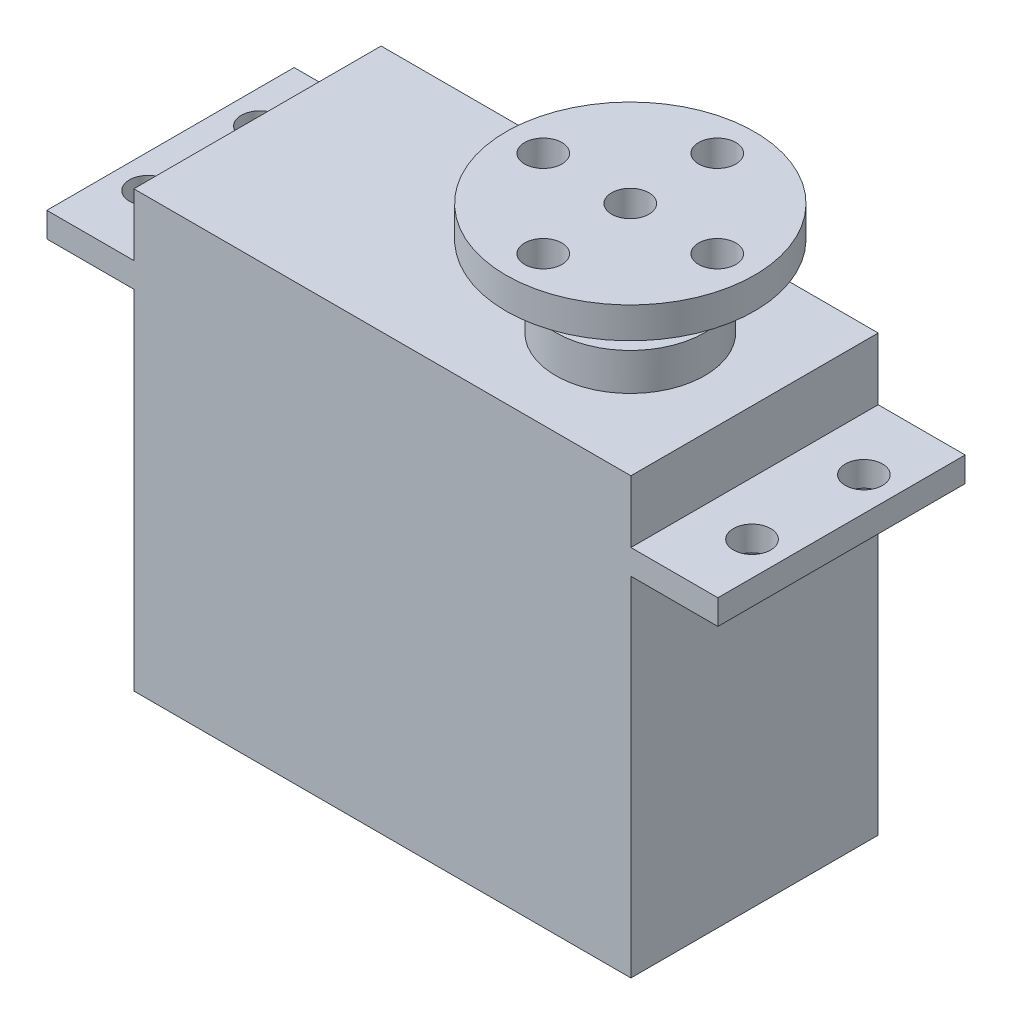
ISO-10303-21;
HEADER;
FILE_DESCRIPTION(('STEP AP214'),'2;1');
FILE_NAME('part.step','',(''),(''),'','','');
FILE_SCHEMA(('AUTOMOTIVE_DESIGN { 1 0 10303 214 1 1 1 1 }'));
ENDSEC;
DATA;
#1=APPLICATION_CONTEXT('core data for automotive mechanical design processes');
#2=APPLICATION_PROTOCOL_DEFINITION('international standard','automotive_design',2000,#1);
#3=PRODUCT_CONTEXT('',#1,'mechanical');
#4=PRODUCT('Part','Part','',(#3));
#5=PRODUCT_RELATED_PRODUCT_CATEGORY('part','',(#4));
#6=PRODUCT_DEFINITION_FORMATION('','',#4);
#7=PRODUCT_DEFINITION_CONTEXT('part definition',#1,'design');
#8=PRODUCT_DEFINITION('design','',#6,#7);
#9=PRODUCT_DEFINITION_SHAPE('','',#8);
#10=(LENGTH_UNIT() NAMED_UNIT(*) SI_UNIT(.MILLI.,.METRE.));
#11=(NAMED_UNIT(*) PLANE_ANGLE_UNIT() SI_UNIT($,.RADIAN.));
#12=(NAMED_UNIT(*) SI_UNIT($,.STERADIAN.) SOLID_ANGLE_UNIT());
#13=UNCERTAINTY_MEASURE_WITH_UNIT(LENGTH_MEASURE(1.E-05),#10,'distance_accuracy_value','');
#14=(GEOMETRIC_REPRESENTATION_CONTEXT(3) GLOBAL_UNCERTAINTY_ASSIGNED_CONTEXT((#13)) GLOBAL_UNIT_ASSIGNED_CONTEXT((#10,
#11,#12)) REPRESENTATION_CONTEXT('',''));
#15=CARTESIAN_POINT('',(0.,0.,0.));
#16=DIRECTION('',(0.,0.,1.));
#17=DIRECTION('',(1.,0.,0.));
#18=AXIS2_PLACEMENT_3D('',#15,#16,#17);
#19=CARTESIAN_POINT('',(9.99999999999999,41.5,0.));
#20=DIRECTION('',(0.,-1.,0.));
#21=DIRECTION('',(0.,0.,-1.));
#22=AXIS2_PLACEMENT_3D('',#19,#20,#21);
#23=CYLINDRICAL_SURFACE('',#22,3.);
#24=CARTESIAN_POINT('',(9.99999999999999,38.,0.));
#25=DIRECTION('',(0.,1.,0.));
#26=DIRECTION('',(0.,0.,1.));
#27=AXIS2_PLACEMENT_3D('',#24,#25,#26);
#28=CIRCLE('',#27,3.);
#29=CARTESIAN_POINT('',(9.99999999999999,38.,-3.));
#30=VERTEX_POINT('',#29);
#31=EDGE_CURVE('E253',#30,#30,#28,.T.);
#32=CARTESIAN_POINT('',(9.99999999999999,39.5,0.));
#33=DIRECTION('',(0.,1.,0.));
#34=DIRECTION('',(0.,0.,1.));
#35=AXIS2_PLACEMENT_3D('',#32,#33,#34);
#36=CIRCLE('',#35,3.);
#37=CARTESIAN_POINT('',(9.99999999999999,39.5,-3.));
#38=VERTEX_POINT('',#37);
#39=EDGE_CURVE('E11',#38,#38,#36,.T.);
#40=CARTESIAN_POINT('',(9.99999999999999,38.,-3.));
#41=CARTESIAN_POINT('',(9.99999999999999,38.015625,-3.));
#42=CARTESIAN_POINT('',(9.99999999999999,38.03125,-3.));
#43=CARTESIAN_POINT('',(9.99999999999999,38.0625,-3.));
#44=CARTESIAN_POINT('',(9.99999999999999,38.078125,-3.));
#45=CARTESIAN_POINT('',(9.99999999999999,38.109375,-3.));
#46=CARTESIAN_POINT('',(9.99999999999999,38.125,-3.));
#47=CARTESIAN_POINT('',(9.99999999999999,38.15625,-3.));
#48=CARTESIAN_POINT('',(9.99999999999999,38.171875,-3.));
#49=CARTESIAN_POINT('',(9.99999999999999,38.203125,-3.));
#50=CARTESIAN_POINT('',(9.99999999999999,38.21875,-3.));
#51=CARTESIAN_POINT('',(9.99999999999999,38.25,-3.));
#52=CARTESIAN_POINT('',(9.99999999999999,38.265625,-3.));
#53=CARTESIAN_POINT('',(9.99999999999999,38.296875,-3.));
#54=CARTESIAN_POINT('',(9.99999999999999,38.3125,-3.));
#55=CARTESIAN_POINT('',(9.99999999999999,38.34375,-3.));
#56=CARTESIAN_POINT('',(9.99999999999999,38.359375,-3.));
#57=CARTESIAN_POINT('',(9.99999999999999,38.390625,-3.));
#58=CARTESIAN_POINT('',(9.99999999999999,38.40625,-3.));
#59=CARTESIAN_POINT('',(9.99999999999999,38.4375,-3.));
#60=CARTESIAN_POINT('',(9.99999999999999,38.453125,-3.));
#61=CARTESIAN_POINT('',(9.99999999999999,38.484375,-3.));
#62=CARTESIAN_POINT('',(9.99999999999999,38.5,-3.));
#63=CARTESIAN_POINT('',(9.99999999999999,38.53125,-3.));
#64=CARTESIAN_POINT('',(9.99999999999999,38.546875,-3.));
#65=CARTESIAN_POINT('',(9.99999999999999,38.578125,-3.));
#66=CARTESIAN_POINT('',(9.99999999999999,38.59375,-3.));
#67=CARTESIAN_POINT('',(9.99999999999999,38.625,-3.));
#68=CARTESIAN_POINT('',(9.99999999999999,38.640625,-3.));
#69=CARTESIAN_POINT('',(9.99999999999999,38.671875,-3.));
#70=CARTESIAN_POINT('',(9.99999999999999,38.6875,-3.));
#71=CARTESIAN_POINT('',(9.99999999999999,38.71875,-3.));
#72=CARTESIAN_POINT('',(9.99999999999999,38.734375,-3.));
#73=CARTESIAN_POINT('',(9.99999999999999,38.765625,-3.));
#74=CARTESIAN_POINT('',(9.99999999999999,38.78125,-3.));
#75=CARTESIAN_POINT('',(9.99999999999999,38.8125,-3.));
#76=CARTESIAN_POINT('',(9.99999999999999,38.828125,-3.));
#77=CARTESIAN_POINT('',(9.99999999999999,38.859375,-3.));
#78=CARTESIAN_POINT('',(9.99999999999999,38.875,-3.));
#79=CARTESIAN_POINT('',(9.99999999999999,38.90625,-3.));
#80=CARTESIAN_POINT('',(9.99999999999999,38.921875,-3.));
#81=CARTESIAN_POINT('',(9.99999999999999,38.953125,-3.));
#82=CARTESIAN_POINT('',(9.99999999999999,38.96875,-3.));
#83=CARTESIAN_POINT('',(9.99999999999999,39.,-3.));
#84=CARTESIAN_POINT('',(9.99999999999999,39.015625,-3.));
#85=CARTESIAN_POINT('',(9.99999999999999,39.046875,-3.));
#86=CARTESIAN_POINT('',(9.99999999999999,39.0625,-3.));
#87=CARTESIAN_POINT('',(9.99999999999999,39.09375,-3.));
#88=CARTESIAN_POINT('',(9.99999999999999,39.109375,-3.));
#89=CARTESIAN_POINT('',(9.99999999999999,39.140625,-3.));
#90=CARTESIAN_POINT('',(9.99999999999999,39.15625,-3.));
#91=CARTESIAN_POINT('',(9.99999999999999,39.1875,-3.));
#92=CARTESIAN_POINT('',(9.99999999999999,39.203125,-3.));
#93=CARTESIAN_POINT('',(9.99999999999999,39.234375,-3.));
#94=CARTESIAN_POINT('',(9.99999999999999,39.25,-3.));
#95=CARTESIAN_POINT('',(9.99999999999999,39.28125,-3.));
#96=CARTESIAN_POINT('',(9.99999999999999,39.296875,-3.));
#97=CARTESIAN_POINT('',(9.99999999999999,39.328125,-3.));
#98=CARTESIAN_POINT('',(9.99999999999999,39.34375,-3.));
#99=CARTESIAN_POINT('',(9.99999999999999,39.375,-3.));
#100=CARTESIAN_POINT('',(9.99999999999999,39.390625,-3.));
#101=CARTESIAN_POINT('',(9.99999999999999,39.421875,-3.));
#102=CARTESIAN_POINT('',(9.99999999999999,39.4375,-3.));
#103=CARTESIAN_POINT('',(9.99999999999999,39.46875,-3.));
#104=CARTESIAN_POINT('',(9.99999999999999,39.484375,-3.));
#105=CARTESIAN_POINT('',(9.99999999999999,39.5,-3.));
#106=B_SPLINE_CURVE_WITH_KNOTS('',3,(#40,#41,#42,#43,#44,#45,#46,#47,#48,#49,#50,#51,#52,#53,
#54,#55,#56,#57,#58,#59,#60,#61,#62,#63,#64,#65,#66,#67,#68,#69,#70,#71,#72,#73,#74,#75,#76,#77,
#78,#79,#80,#81,#82,#83,#84,#85,#86,#87,#88,#89,#90,#91,#92,#93,#94,#95,#96,#97,#98,#99,#100,
#101,#102,#103,#104,#105),.UNSPECIFIED.,.F.,.F.,(4,2,2,2,2,2,2,2,2,2,2,2,2,2,2,2,2,2,2,2,2,2,2,
2,2,2,2,2,2,2,2,2,4),(0.,0.0468749999999948,0.0937499999999966,0.140624999999998,
0.187499999999993,0.234374999999995,0.281249999999997,0.328124999999999,0.374999999999993,
0.421874999999995,0.468749999999997,0.515624999999992,0.562499999999994,0.609374999999995,
0.656249999999997,0.703124999999992,0.749999999999994,0.796874999999996,0.84374999999999,
0.890624999999992,0.937499999999994,0.984374999999996,1.03124999999999,1.07812499999999,
1.12499999999999,1.17187499999999,1.21874999999999,1.26562499999999,1.31249999999999,
1.35937499999999,1.40624999999999,1.45312499999999,1.49999999999999),.UNSPECIFIED.);
#107=EDGE_CURVE('BSEAM39',#30,#38,#106,.T.);
#108=ORIENTED_EDGE('',*,*,#31,.T.);
#109=ORIENTED_EDGE('',*,*,#39,.F.);
#110=ORIENTED_EDGE('',*,*,#107,.T.);
#111=ORIENTED_EDGE('',*,*,#107,.F.);
#112=EDGE_LOOP('',(#108,#110,#109,#111));
#113=FACE_BOUND('',#112,.T.);
#114=ADVANCED_FACE('F39',(#113),#23,.T.);
#115=CARTESIAN_POINT('',(0.,30.,0.));
#116=DIRECTION('',(0.,1.,0.));
#117=DIRECTION('',(0.,0.,1.));
#118=AXIS2_PLACEMENT_3D('',#115,#116,#117);
#119=PLANE('',#118);
#120=CARTESIAN_POINT('',(24.3,30.,4.49999999999999));
#121=DIRECTION('',(0.,1.,0.));
#122=DIRECTION('',(0.,0.,-1.));
#123=AXIS2_PLACEMENT_3D('',#120,#121,#122);
#124=CIRCLE('',#123,1.5);
#125=CARTESIAN_POINT('',(24.3,30.,2.99999999999999));
#126=VERTEX_POINT('',#125);
#127=EDGE_CURVE('E650',#126,#126,#124,.T.);
#128=ORIENTED_EDGE('',*,*,#127,.F.);
#129=EDGE_LOOP('',(#128));
#130=FACE_BOUND('',#129,.T.);
#131=CARTESIAN_POINT('',(24.3,30.,-4.5));
#132=DIRECTION('',(0.,1.,0.));
#133=DIRECTION('',(0.,0.,1.));
#134=AXIS2_PLACEMENT_3D('',#131,#132,#133);
#135=CIRCLE('',#134,1.5);
#136=CARTESIAN_POINT('',(24.3,30.,-3.));
#137=VERTEX_POINT('',#136);
#138=EDGE_CURVE('E646',#137,#137,#135,.T.);
#139=ORIENTED_EDGE('',*,*,#138,.F.);
#140=EDGE_LOOP('',(#139));
#141=FACE_BOUND('',#140,.T.);
#142=DIRECTION('',(0.,0.,-1.));
#143=VECTOR('',#142,1.);
#144=CARTESIAN_POINT('',(20.,30.,9.95));
#145=LINE('',#144,#143);
#146=CARTESIAN_POINT('',(20.,30.,9.95));
#147=VERTEX_POINT('',#146);
#148=CARTESIAN_POINT('',(20.,30.,-9.95));
#149=VERTEX_POINT('',#148);
#150=EDGE_CURVE('E152',#147,#149,#145,.T.);
#151=ORIENTED_EDGE('',*,*,#150,.F.);
#152=DIRECTION('',(1.,0.,0.));
#153=VECTOR('',#152,1.);
#154=CARTESIAN_POINT('',(27.,30.,9.95));
#155=LINE('',#154,#153);
#156=CARTESIAN_POINT('',(27.,30.,9.95));
#157=VERTEX_POINT('',#156);
#158=EDGE_CURVE('E169',#147,#157,#155,.T.);
#159=ORIENTED_EDGE('',*,*,#158,.T.);
#160=DIRECTION('',(0.,0.,-1.));
#161=VECTOR('',#160,1.);
#162=CARTESIAN_POINT('',(27.,30.,9.95));
#163=LINE('',#162,#161);
#164=CARTESIAN_POINT('',(27.,30.,-9.95));
#165=VERTEX_POINT('',#164);
#166=EDGE_CURVE('E174',#157,#165,#163,.T.);
#167=ORIENTED_EDGE('',*,*,#166,.T.);
#168=DIRECTION('',(-1.,0.,0.));
#169=VECTOR('',#168,1.);
#170=CARTESIAN_POINT('',(27.,30.,-9.95));
#171=LINE('',#170,#169);
#172=EDGE_CURVE('E63',#165,#149,#171,.T.);
#173=ORIENTED_EDGE('',*,*,#172,.T.);
#174=EDGE_LOOP('',(#151,#159,#167,#173));
#175=FACE_BOUND('',#174,.T.);
#176=ADVANCED_FACE('F278',(#130,#141,#175),#119,.T.);
#177=CARTESIAN_POINT('',(20.,28.,9.95));
#178=DIRECTION('',(-1.,0.,0.));
#179=DIRECTION('',(0.,0.,1.));
#180=AXIS2_PLACEMENT_3D('',#177,#178,#179);
#181=PLANE('',#180);
#182=DIRECTION('',(0.,0.,-1.));
#183=VECTOR('',#182,1.);
#184=CARTESIAN_POINT('',(20.,0.,9.95));
#185=LINE('',#184,#183);
#186=CARTESIAN_POINT('',(20.,0.,9.95));
#187=VERTEX_POINT('',#186);
#188=CARTESIAN_POINT('',(20.,0.,-9.95));
#189=VERTEX_POINT('',#188);
#190=EDGE_CURVE('E207',#187,#189,#185,.T.);
#191=ORIENTED_EDGE('',*,*,#190,.T.);
#192=DIRECTION('',(0.,-1.,0.));
#193=VECTOR('',#192,1.);
#194=CARTESIAN_POINT('',(20.,28.,-9.95));
#195=LINE('',#194,#193);
#196=CARTESIAN_POINT('',(20.,28.,-9.95));
#197=VERTEX_POINT('',#196);
#198=EDGE_CURVE('E240',#197,#189,#195,.T.);
#199=ORIENTED_EDGE('',*,*,#198,.F.);
#200=DIRECTION('',(0.,0.,-1.));
#201=VECTOR('',#200,1.);
#202=CARTESIAN_POINT('',(20.,28.,9.95));
#203=LINE('',#202,#201);
#204=CARTESIAN_POINT('',(20.,28.,9.95));
#205=VERTEX_POINT('',#204);
#206=EDGE_CURVE('E208',#205,#197,#203,.T.);
#207=ORIENTED_EDGE('',*,*,#206,.F.);
#208=DIRECTION('',(0.,-1.,0.));
#209=VECTOR('',#208,1.);
#210=CARTESIAN_POINT('',(20.,28.,9.95));
#211=LINE('',#210,#209);
#212=EDGE_CURVE('E217',#205,#187,#211,.T.);
#213=ORIENTED_EDGE('',*,*,#212,.T.);
#214=EDGE_LOOP('',(#191,#199,#207,#213));
#215=FACE_BOUND('',#214,.T.);
#216=ADVANCED_FACE('F41',(#215),#181,.F.);
#217=CARTESIAN_POINT('',(-20.,28.,-9.95));
#218=DIRECTION('',(0.,0.,1.));
#219=DIRECTION('',(1.,0.,0.));
#220=AXIS2_PLACEMENT_3D('',#217,#218,#219);
#221=PLANE('',#220);
#222=DIRECTION('',(-1.,0.,0.));
#223=VECTOR('',#222,1.);
#224=CARTESIAN_POINT('',(-20.,0.,-9.95));
#225=LINE('',#224,#223);
#226=CARTESIAN_POINT('',(-20.,0.,-9.95));
#227=VERTEX_POINT('',#226);
#228=EDGE_CURVE('E221',#189,#227,#225,.T.);
#229=ORIENTED_EDGE('',*,*,#228,.T.);
#230=DIRECTION('',(0.,-1.,0.));
#231=VECTOR('',#230,1.);
#232=CARTESIAN_POINT('',(-20.,28.,-9.95));
#233=LINE('',#232,#231);
#234=CARTESIAN_POINT('',(-20.,28.,-9.95));
#235=VERTEX_POINT('',#234);
#236=EDGE_CURVE('E236',#235,#227,#233,.T.);
#237=ORIENTED_EDGE('',*,*,#236,.F.);
#238=DIRECTION('',(-1.,0.,0.));
#239=VECTOR('',#238,1.);
#240=CARTESIAN_POINT('',(27.,28.,-9.95));
#241=LINE('',#240,#239);
#242=CARTESIAN_POINT('',(-27.,28.,-9.95));
#243=VERTEX_POINT('',#242);
#244=EDGE_CURVE('E188',#235,#243,#241,.T.);
#245=ORIENTED_EDGE('',*,*,#244,.T.);
#246=DIRECTION('',(0.,-1.,0.));
#247=VECTOR('',#246,1.);
#248=CARTESIAN_POINT('',(-27.,30.,-9.95));
#249=LINE('',#248,#247);
#250=CARTESIAN_POINT('',(-27.,30.,-9.95));
#251=VERTEX_POINT('',#250);
#252=EDGE_CURVE('E179',#251,#243,#249,.T.);
#253=ORIENTED_EDGE('',*,*,#252,.F.);
#254=CARTESIAN_POINT('',(-20.,30.,-9.95));
#255=VERTEX_POINT('',#254);
#256=EDGE_CURVE('E177',#255,#251,#171,.T.);
#257=ORIENTED_EDGE('',*,*,#256,.F.);
#258=DIRECTION('',(0.,-1.,0.));
#259=VECTOR('',#258,1.);
#260=CARTESIAN_POINT('',(-20.,35.,-9.95));
#261=LINE('',#260,#259);
#262=CARTESIAN_POINT('',(-20.,35.,-9.95));
#263=VERTEX_POINT('',#262);
#264=EDGE_CURVE('E135',#263,#255,#261,.T.);
#265=ORIENTED_EDGE('',*,*,#264,.F.);
#266=DIRECTION('',(-1.,0.,0.));
#267=VECTOR('',#266,1.);
#268=CARTESIAN_POINT('',(-20.,35.,-9.95));
#269=LINE('',#268,#267);
#270=CARTESIAN_POINT('',(20.,35.,-9.95));
#271=VERTEX_POINT('',#270);
#272=EDGE_CURVE('E128',#271,#263,#269,.T.);
#273=ORIENTED_EDGE('',*,*,#272,.F.);
#274=DIRECTION('',(0.,-1.,0.));
#275=VECTOR('',#274,1.);
#276=CARTESIAN_POINT('',(20.,35.,-9.95));
#277=LINE('',#276,#275);
#278=EDGE_CURVE('E132',#271,#149,#277,.T.);
#279=ORIENTED_EDGE('',*,*,#278,.T.);
#280=ORIENTED_EDGE('',*,*,#172,.F.);
#281=DIRECTION('',(0.,-1.,0.));
#282=VECTOR('',#281,1.);
#283=CARTESIAN_POINT('',(27.,30.,-9.95));
#284=LINE('',#283,#282);
#285=CARTESIAN_POINT('',(27.,28.,-9.95));
#286=VERTEX_POINT('',#285);
#287=EDGE_CURVE('E195',#165,#286,#284,.T.);
#288=ORIENTED_EDGE('',*,*,#287,.T.);
#289=EDGE_CURVE('E170',#286,#197,#241,.T.);
#290=ORIENTED_EDGE('',*,*,#289,.T.);
#291=ORIENTED_EDGE('',*,*,#198,.T.);
#292=EDGE_LOOP('',(#229,#237,#245,#253,#257,#265,#273,#279,#280,#288,#290,#291));
#293=FACE_BOUND('',#292,.T.);
#294=ADVANCED_FACE('F130',(#293),#221,.F.);
#295=CARTESIAN_POINT('',(-20.,28.,9.95));
#296=DIRECTION('',(1.,0.,0.));
#297=DIRECTION('',(0.,0.,-1.));
#298=AXIS2_PLACEMENT_3D('',#295,#296,#297);
#299=PLANE('',#298);
#300=DIRECTION('',(0.,0.,1.));
#301=VECTOR('',#300,1.);
#302=CARTESIAN_POINT('',(-20.,0.,9.95));
#303=LINE('',#302,#301);
#304=CARTESIAN_POINT('',(-20.,0.,9.95));
#305=VERTEX_POINT('',#304);
#306=EDGE_CURVE('E224',#227,#305,#303,.T.);
#307=ORIENTED_EDGE('',*,*,#306,.T.);
#308=DIRECTION('',(0.,-1.,0.));
#309=VECTOR('',#308,1.);
#310=CARTESIAN_POINT('',(-20.,28.,9.95));
#311=LINE('',#310,#309);
#312=CARTESIAN_POINT('',(-20.,28.,9.95));
#313=VERTEX_POINT('',#312);
#314=EDGE_CURVE('E232',#313,#305,#311,.T.);
#315=ORIENTED_EDGE('',*,*,#314,.F.);
#316=DIRECTION('',(0.,0.,1.));
#317=VECTOR('',#316,1.);
#318=CARTESIAN_POINT('',(-20.,28.,9.95));
#319=LINE('',#318,#317);
#320=EDGE_CURVE('E212',#235,#313,#319,.T.);
#321=ORIENTED_EDGE('',*,*,#320,.F.);
#322=ORIENTED_EDGE('',*,*,#236,.T.);
#323=EDGE_LOOP('',(#307,#315,#321,#322));
#324=FACE_BOUND('',#323,.T.);
#325=ADVANCED_FACE('F355',(#324),#299,.F.);
#326=CARTESIAN_POINT('',(-20.,28.,9.95));
#327=DIRECTION('',(0.,0.,-1.));
#328=DIRECTION('',(-1.,0.,0.));
#329=AXIS2_PLACEMENT_3D('',#326,#327,#328);
#330=PLANE('',#329);
#331=DIRECTION('',(1.,0.,0.));
#332=VECTOR('',#331,1.);
#333=CARTESIAN_POINT('',(-20.,0.,9.95));
#334=LINE('',#333,#332);
#335=EDGE_CURVE('E213',#305,#187,#334,.T.);
#336=ORIENTED_EDGE('',*,*,#335,.T.);
#337=ORIENTED_EDGE('',*,*,#212,.F.);
#338=DIRECTION('',(1.,0.,0.));
#339=VECTOR('',#338,1.);
#340=CARTESIAN_POINT('',(27.,28.,9.95));
#341=LINE('',#340,#339);
#342=CARTESIAN_POINT('',(27.,28.,9.95));
#343=VERTEX_POINT('',#342);
#344=EDGE_CURVE('E159',#205,#343,#341,.T.);
#345=ORIENTED_EDGE('',*,*,#344,.T.);
#346=DIRECTION('',(0.,-1.,0.));
#347=VECTOR('',#346,1.);
#348=CARTESIAN_POINT('',(27.,30.,9.95));
#349=LINE('',#348,#347);
#350=EDGE_CURVE('E199',#157,#343,#349,.T.);
#351=ORIENTED_EDGE('',*,*,#350,.F.);
#352=ORIENTED_EDGE('',*,*,#158,.F.);
#353=DIRECTION('',(0.,-1.,0.));
#354=VECTOR('',#353,1.);
#355=CARTESIAN_POINT('',(20.,35.,9.95));
#356=LINE('',#355,#354);
#357=CARTESIAN_POINT('',(20.,35.,9.95));
#358=VERTEX_POINT('',#357);
#359=EDGE_CURVE('E322',#358,#147,#356,.T.);
#360=ORIENTED_EDGE('',*,*,#359,.F.);
#361=DIRECTION('',(1.,0.,0.));
#362=VECTOR('',#361,1.);
#363=CARTESIAN_POINT('',(-20.,35.,9.95));
#364=LINE('',#363,#362);
#365=CARTESIAN_POINT('',(-20.,35.,9.95));
#366=VERTEX_POINT('',#365);
#367=EDGE_CURVE('E145',#366,#358,#364,.T.);
#368=ORIENTED_EDGE('',*,*,#367,.F.);
#369=DIRECTION('',(0.,-1.,0.));
#370=VECTOR('',#369,1.);
#371=CARTESIAN_POINT('',(-20.,35.,9.95));
#372=LINE('',#371,#370);
#373=CARTESIAN_POINT('',(-20.,30.,9.95));
#374=VERTEX_POINT('',#373);
#375=EDGE_CURVE('E161',#366,#374,#372,.T.);
#376=ORIENTED_EDGE('',*,*,#375,.T.);
#377=CARTESIAN_POINT('',(-27.,30.,9.95));
#378=VERTEX_POINT('',#377);
#379=EDGE_CURVE('E171',#378,#374,#155,.T.);
#380=ORIENTED_EDGE('',*,*,#379,.F.);
#381=DIRECTION('',(0.,-1.,0.));
#382=VECTOR('',#381,1.);
#383=CARTESIAN_POINT('',(-27.,30.,9.95));
#384=LINE('',#383,#382);
#385=CARTESIAN_POINT('',(-27.,28.,9.95));
#386=VERTEX_POINT('',#385);
#387=EDGE_CURVE('E203',#378,#386,#384,.T.);
#388=ORIENTED_EDGE('',*,*,#387,.T.);
#389=EDGE_CURVE('E181',#386,#313,#341,.T.);
#390=ORIENTED_EDGE('',*,*,#389,.T.);
#391=ORIENTED_EDGE('',*,*,#314,.T.);
#392=EDGE_LOOP('',(#336,#337,#345,#351,#352,#360,#368,#376,#380,#388,#390,#391));
#393=FACE_BOUND('',#392,.T.);
#394=ADVANCED_FACE('F332',(#393),#330,.F.);
#395=CARTESIAN_POINT('',(0.,0.,0.));
#396=DIRECTION('',(0.,-1.,0.));
#397=DIRECTION('',(0.,0.,-1.));
#398=AXIS2_PLACEMENT_3D('',#395,#396,#397);
#399=PLANE('',#398);
#400=ORIENTED_EDGE('',*,*,#190,.F.);
#401=ORIENTED_EDGE('',*,*,#335,.F.);
#402=ORIENTED_EDGE('',*,*,#306,.F.);
#403=ORIENTED_EDGE('',*,*,#228,.F.);
#404=EDGE_LOOP('',(#400,#401,#402,#403));
#405=FACE_BOUND('',#404,.T.);
#406=ADVANCED_FACE('F352',(#405),#399,.T.);
#407=CARTESIAN_POINT('',(0.,28.,0.));
#408=DIRECTION('',(0.,1.,0.));
#409=DIRECTION('',(0.,0.,1.));
#410=AXIS2_PLACEMENT_3D('',#407,#408,#409);
#411=PLANE('',#410);
#412=CARTESIAN_POINT('',(24.3,28.,4.49999999999999));
#413=DIRECTION('',(0.,1.,0.));
#414=DIRECTION('',(0.,0.,1.));
#415=AXIS2_PLACEMENT_3D('',#412,#413,#414);
#416=CIRCLE('',#415,1.5);
#417=CARTESIAN_POINT('',(24.3,28.,5.99999999999999));
#418=VERTEX_POINT('',#417);
#419=EDGE_CURVE('E248',#418,#418,#416,.T.);
#420=ORIENTED_EDGE('',*,*,#419,.T.);
#421=EDGE_LOOP('',(#420));
#422=FACE_BOUND('',#421,.T.);
#423=CARTESIAN_POINT('',(24.3,28.,-4.5));
#424=DIRECTION('',(0.,1.,0.));
#425=DIRECTION('',(0.,0.,1.));
#426=AXIS2_PLACEMENT_3D('',#423,#424,#425);
#427=CIRCLE('',#426,1.5);
#428=CARTESIAN_POINT('',(24.3,28.,-3.));
#429=VERTEX_POINT('',#428);
#430=EDGE_CURVE('E244',#429,#429,#427,.T.);
#431=ORIENTED_EDGE('',*,*,#430,.T.);
#432=EDGE_LOOP('',(#431));
#433=FACE_BOUND('',#432,.T.);
#434=ORIENTED_EDGE('',*,*,#344,.F.);
#435=ORIENTED_EDGE('',*,*,#206,.T.);
#436=ORIENTED_EDGE('',*,*,#289,.F.);
#437=DIRECTION('',(0.,0.,-1.));
#438=VECTOR('',#437,1.);
#439=CARTESIAN_POINT('',(27.,28.,9.95));
#440=LINE('',#439,#438);
#441=EDGE_CURVE('E185',#343,#286,#440,.T.);
#442=ORIENTED_EDGE('',*,*,#441,.F.);
#443=EDGE_LOOP('',(#434,#435,#436,#442));
#444=FACE_BOUND('',#443,.T.);
#445=ADVANCED_FACE('F347',(#422,#433,#444),#411,.F.);
#446=CARTESIAN_POINT('',(-24.3,28.,4.49999999999999));
#447=DIRECTION('',(0.,1.,0.));
#448=DIRECTION('',(0.,0.,1.));
#449=AXIS2_PLACEMENT_3D('',#446,#447,#448);
#450=CIRCLE('',#449,1.5);
#451=CARTESIAN_POINT('',(-24.3,28.,5.99999999999999));
#452=VERTEX_POINT('',#451);
#453=EDGE_CURVE('E249',#452,#452,#450,.T.);
#454=ORIENTED_EDGE('',*,*,#453,.T.);
#455=EDGE_LOOP('',(#454));
#456=FACE_BOUND('',#455,.T.);
#457=CARTESIAN_POINT('',(-24.3,28.,-4.5));
#458=DIRECTION('',(0.,1.,0.));
#459=DIRECTION('',(0.,0.,1.));
#460=AXIS2_PLACEMENT_3D('',#457,#458,#459);
#461=CIRCLE('',#460,1.5);
#462=CARTESIAN_POINT('',(-24.3,28.,-3.));
#463=VERTEX_POINT('',#462);
#464=EDGE_CURVE('E310',#463,#463,#461,.T.);
#465=ORIENTED_EDGE('',*,*,#464,.T.);
#466=EDGE_LOOP('',(#465));
#467=FACE_BOUND('',#466,.T.);
#468=ORIENTED_EDGE('',*,*,#244,.F.);
#469=ORIENTED_EDGE('',*,*,#320,.T.);
#470=ORIENTED_EDGE('',*,*,#389,.F.);
#471=DIRECTION('',(0.,0.,1.));
#472=VECTOR('',#471,1.);
#473=CARTESIAN_POINT('',(-27.,28.,9.95));
#474=LINE('',#473,#472);
#475=EDGE_CURVE('E154',#243,#386,#474,.T.);
#476=ORIENTED_EDGE('',*,*,#475,.F.);
#477=EDGE_LOOP('',(#468,#469,#470,#476));
#478=FACE_BOUND('',#477,.T.);
#479=ADVANCED_FACE('F361',(#456,#467,#478),#411,.F.);
#480=CARTESIAN_POINT('',(-27.,30.,9.95));
#481=DIRECTION('',(1.,0.,0.));
#482=DIRECTION('',(0.,0.,-1.));
#483=AXIS2_PLACEMENT_3D('',#480,#481,#482);
#484=PLANE('',#483);
#485=ORIENTED_EDGE('',*,*,#475,.T.);
#486=ORIENTED_EDGE('',*,*,#387,.F.);
#487=DIRECTION('',(0.,0.,1.));
#488=VECTOR('',#487,1.);
#489=CARTESIAN_POINT('',(-27.,30.,9.95));
#490=LINE('',#489,#488);
#491=EDGE_CURVE('E165',#251,#378,#490,.T.);
#492=ORIENTED_EDGE('',*,*,#491,.F.);
#493=ORIENTED_EDGE('',*,*,#252,.T.);
#494=EDGE_LOOP('',(#485,#486,#492,#493));
#495=FACE_BOUND('',#494,.T.);
#496=ADVANCED_FACE('F365',(#495),#484,.F.);
#497=CARTESIAN_POINT('',(27.,30.,9.95));
#498=DIRECTION('',(-1.,0.,0.));
#499=DIRECTION('',(0.,0.,1.));
#500=AXIS2_PLACEMENT_3D('',#497,#498,#499);
#501=PLANE('',#500);
#502=ORIENTED_EDGE('',*,*,#441,.T.);
#503=ORIENTED_EDGE('',*,*,#287,.F.);
#504=ORIENTED_EDGE('',*,*,#166,.F.);
#505=ORIENTED_EDGE('',*,*,#350,.T.);
#506=EDGE_LOOP('',(#502,#503,#504,#505));
#507=FACE_BOUND('',#506,.T.);
#508=ADVANCED_FACE('F344',(#507),#501,.F.);
#509=CARTESIAN_POINT('',(-24.3,30.,4.49999999999999));
#510=DIRECTION('',(0.,1.,0.));
#511=DIRECTION('',(0.,0.,-1.));
#512=AXIS2_PLACEMENT_3D('',#509,#510,#511);
#513=CIRCLE('',#512,1.5);
#514=CARTESIAN_POINT('',(-24.3,30.,2.99999999999999));
#515=VERTEX_POINT('',#514);
#516=EDGE_CURVE('E256',#515,#515,#513,.T.);
#517=ORIENTED_EDGE('',*,*,#516,.F.);
#518=EDGE_LOOP('',(#517));
#519=FACE_BOUND('',#518,.T.);
#520=CARTESIAN_POINT('',(-24.3,30.,-4.5));
#521=DIRECTION('',(0.,1.,0.));
#522=DIRECTION('',(0.,0.,1.));
#523=AXIS2_PLACEMENT_3D('',#520,#521,#522);
#524=CIRCLE('',#523,1.5);
#525=CARTESIAN_POINT('',(-24.3,30.,-3.));
#526=VERTEX_POINT('',#525);
#527=EDGE_CURVE('E314',#526,#526,#524,.T.);
#528=ORIENTED_EDGE('',*,*,#527,.F.);
#529=EDGE_LOOP('',(#528));
#530=FACE_BOUND('',#529,.T.);
#531=DIRECTION('',(0.,0.,1.));
#532=VECTOR('',#531,1.);
#533=CARTESIAN_POINT('',(-20.,30.,9.95));
#534=LINE('',#533,#532);
#535=EDGE_CURVE('E55',#255,#374,#534,.T.);
#536=ORIENTED_EDGE('',*,*,#535,.F.);
#537=ORIENTED_EDGE('',*,*,#256,.T.);
#538=ORIENTED_EDGE('',*,*,#491,.T.);
#539=ORIENTED_EDGE('',*,*,#379,.T.);
#540=EDGE_LOOP('',(#536,#537,#538,#539));
#541=FACE_BOUND('',#540,.T.);
#542=ADVANCED_FACE('F286',(#519,#530,#541),#119,.T.);
#543=CARTESIAN_POINT('',(20.,35.,9.95));
#544=DIRECTION('',(-1.,0.,0.));
#545=DIRECTION('',(0.,0.,1.));
#546=AXIS2_PLACEMENT_3D('',#543,#544,#545);
#547=PLANE('',#546);
#548=ORIENTED_EDGE('',*,*,#150,.T.);
#549=ORIENTED_EDGE('',*,*,#278,.F.);
#550=DIRECTION('',(0.,0.,-1.));
#551=VECTOR('',#550,1.);
#552=CARTESIAN_POINT('',(20.,35.,9.95));
#553=LINE('',#552,#551);
#554=EDGE_CURVE('E140',#358,#271,#553,.T.);
#555=ORIENTED_EDGE('',*,*,#554,.F.);
#556=ORIENTED_EDGE('',*,*,#359,.T.);
#557=EDGE_LOOP('',(#548,#549,#555,#556));
#558=FACE_BOUND('',#557,.T.);
#559=ADVANCED_FACE('F151',(#558),#547,.F.);
#560=CARTESIAN_POINT('',(-20.,35.,9.95));
#561=DIRECTION('',(1.,0.,0.));
#562=DIRECTION('',(0.,0.,-1.));
#563=AXIS2_PLACEMENT_3D('',#560,#561,#562);
#564=PLANE('',#563);
#565=ORIENTED_EDGE('',*,*,#535,.T.);
#566=ORIENTED_EDGE('',*,*,#375,.F.);
#567=DIRECTION('',(0.,0.,1.));
#568=VECTOR('',#567,1.);
#569=CARTESIAN_POINT('',(-20.,35.,9.95));
#570=LINE('',#569,#568);
#571=EDGE_CURVE('E139',#263,#366,#570,.T.);
#572=ORIENTED_EDGE('',*,*,#571,.F.);
#573=ORIENTED_EDGE('',*,*,#264,.T.);
#574=EDGE_LOOP('',(#565,#566,#572,#573));
#575=FACE_BOUND('',#574,.T.);
#576=ADVANCED_FACE('F266',(#575),#564,.F.);
#577=CARTESIAN_POINT('',(0.,35.,0.));
#578=DIRECTION('',(0.,-1.,0.));
#579=DIRECTION('',(0.,0.,-1.));
#580=AXIS2_PLACEMENT_3D('',#577,#578,#579);
#581=PLANE('',#580);
#582=CARTESIAN_POINT('',(9.99999999999999,35.,0.));
#583=DIRECTION('',(0.,-1.,0.));
#584=DIRECTION('',(0.,0.,-1.));
#585=AXIS2_PLACEMENT_3D('',#582,#583,#584);
#586=CIRCLE('',#585,6.);
#587=CARTESIAN_POINT('',(9.99999999999999,35.,-6.));
#588=VERTEX_POINT('',#587);
#589=EDGE_CURVE('E48',#588,#588,#586,.F.);
#590=ORIENTED_EDGE('',*,*,#589,.F.);
#591=EDGE_LOOP('',(#590));
#592=FACE_BOUND('',#591,.T.);
#593=ORIENTED_EDGE('',*,*,#554,.T.);
#594=ORIENTED_EDGE('',*,*,#272,.T.);
#595=ORIENTED_EDGE('',*,*,#571,.T.);
#596=ORIENTED_EDGE('',*,*,#367,.T.);
#597=EDGE_LOOP('',(#593,#594,#595,#596));
#598=FACE_BOUND('',#597,.T.);
#599=ADVANCED_FACE('F143',(#592,#598),#581,.F.);
#600=CARTESIAN_POINT('',(-24.3,0.,-4.5));
#601=DIRECTION('',(0.,1.,0.));
#602=DIRECTION('',(0.,0.,1.));
#603=AXIS2_PLACEMENT_3D('',#600,#601,#602);
#604=CYLINDRICAL_SURFACE('',#603,1.5);
#605=ORIENTED_EDGE('',*,*,#527,.T.);
#606=EDGE_LOOP('',(#605));
#607=FACE_BOUND('',#606,.T.);
#608=ORIENTED_EDGE('',*,*,#464,.F.);
#609=EDGE_LOOP('',(#608));
#610=FACE_BOUND('',#609,.T.);
#611=ADVANCED_FACE('F265',(#607,#610),#604,.F.);
#612=CARTESIAN_POINT('',(-24.3,0.,4.49999999999999));
#613=DIRECTION('',(0.,1.,0.));
#614=DIRECTION('',(0.,0.,1.));
#615=AXIS2_PLACEMENT_3D('',#612,#613,#614);
#616=CYLINDRICAL_SURFACE('',#615,1.5);
#617=ORIENTED_EDGE('',*,*,#516,.T.);
#618=EDGE_LOOP('',(#617));
#619=FACE_BOUND('',#618,.T.);
#620=ORIENTED_EDGE('',*,*,#453,.F.);
#621=EDGE_LOOP('',(#620));
#622=FACE_BOUND('',#621,.T.);
#623=ADVANCED_FACE('F272',(#619,#622),#616,.F.);
#624=CARTESIAN_POINT('',(24.3,0.,-4.5));
#625=DIRECTION('',(0.,1.,0.));
#626=DIRECTION('',(0.,0.,1.));
#627=AXIS2_PLACEMENT_3D('',#624,#625,#626);
#628=CYLINDRICAL_SURFACE('',#627,1.5);
#629=ORIENTED_EDGE('',*,*,#138,.T.);
#630=EDGE_LOOP('',(#629));
#631=FACE_BOUND('',#630,.T.);
#632=ORIENTED_EDGE('',*,*,#430,.F.);
#633=EDGE_LOOP('',(#632));
#634=FACE_BOUND('',#633,.T.);
#635=ADVANCED_FACE('F291',(#631,#634),#628,.F.);
#636=CARTESIAN_POINT('',(24.3,0.,4.49999999999999));
#637=DIRECTION('',(0.,1.,0.));
#638=DIRECTION('',(0.,0.,1.));
#639=AXIS2_PLACEMENT_3D('',#636,#637,#638);
#640=CYLINDRICAL_SURFACE('',#639,1.5);
#641=ORIENTED_EDGE('',*,*,#127,.T.);
#642=EDGE_LOOP('',(#641));
#643=FACE_BOUND('',#642,.T.);
#644=ORIENTED_EDGE('',*,*,#419,.F.);
#645=EDGE_LOOP('',(#644));
#646=FACE_BOUND('',#645,.T.);
#647=ADVANCED_FACE('F294',(#643,#646),#640,.F.);
#648=CARTESIAN_POINT('',(9.99999999999999,38.,0.));
#649=DIRECTION('',(0.,-1.,0.));
#650=DIRECTION('',(0.,0.,-1.));
#651=AXIS2_PLACEMENT_3D('',#648,#649,#650);
#652=CYLINDRICAL_SURFACE('',#651,6.);
#653=CARTESIAN_POINT('',(9.99999999999999,38.,0.));
#654=DIRECTION('',(0.,1.,0.));
#655=DIRECTION('',(0.,0.,1.));
#656=AXIS2_PLACEMENT_3D('',#653,#654,#655);
#657=CIRCLE('',#656,6.);
#658=CARTESIAN_POINT('',(9.99999999999999,38.,6.));
#659=VERTEX_POINT('',#658);
#660=EDGE_CURVE('E257',#659,#659,#657,.T.);
#661=ORIENTED_EDGE('',*,*,#660,.F.);
#662=EDGE_LOOP('',(#661));
#663=FACE_BOUND('',#662,.T.);
#664=ORIENTED_EDGE('',*,*,#589,.T.);
#665=EDGE_LOOP('',(#664));
#666=FACE_BOUND('',#665,.T.);
#667=ADVANCED_FACE('F262',(#663,#666),#652,.T.);
#668=CARTESIAN_POINT('',(9.99999999999999,38.,0.));
#669=DIRECTION('',(0.,1.,0.));
#670=DIRECTION('',(0.,0.,1.));
#671=AXIS2_PLACEMENT_3D('',#668,#669,#670);
#672=PLANE('',#671);
#673=ORIENTED_EDGE('',*,*,#31,.F.);
#674=EDGE_LOOP('',(#673));
#675=FACE_BOUND('',#674,.T.);
#676=ORIENTED_EDGE('',*,*,#660,.T.);
#677=EDGE_LOOP('',(#676));
#678=FACE_BOUND('',#677,.T.);
#679=ADVANCED_FACE('F459',(#675,#678),#672,.T.);
#680=CARTESIAN_POINT('',(9.99999999999999,39.5,0.));
#681=DIRECTION('',(0.,1.,0.));
#682=DIRECTION('',(0.,0.,1.));
#683=AXIS2_PLACEMENT_3D('',#680,#681,#682);
#684=CYLINDRICAL_SURFACE('',#683,4.5);
#685=CARTESIAN_POINT('',(9.99999999999999,39.5,0.));
#686=DIRECTION('',(0.,1.,0.));
#687=DIRECTION('',(0.,0.,1.));
#688=AXIS2_PLACEMENT_3D('',#685,#686,#687);
#689=CIRCLE('',#688,4.5);
#690=CARTESIAN_POINT('',(9.99999999999999,39.5,4.5));
#691=VERTEX_POINT('',#690);
#692=EDGE_CURVE('E636',#691,#691,#689,.T.);
#693=ORIENTED_EDGE('',*,*,#692,.T.);
#694=EDGE_LOOP('',(#693));
#695=FACE_BOUND('',#694,.T.);
#696=CARTESIAN_POINT('',(9.99999999999999,41.5,0.));
#697=DIRECTION('',(0.,1.,0.));
#698=DIRECTION('',(0.,0.,1.));
#699=AXIS2_PLACEMENT_3D('',#696,#697,#698);
#700=CIRCLE('',#699,4.5);
#701=CARTESIAN_POINT('',(9.99999999999999,41.5,4.5));
#702=VERTEX_POINT('',#701);
#703=EDGE_CURVE('E632',#702,#702,#700,.T.);
#704=ORIENTED_EDGE('',*,*,#703,.F.);
#705=EDGE_LOOP('',(#704));
#706=FACE_BOUND('',#705,.T.);
#707=ADVANCED_FACE('F467',(#695,#706),#684,.T.);
#708=CARTESIAN_POINT('',(9.99999999999999,39.5,0.));
#709=DIRECTION('',(0.,1.,0.));
#710=DIRECTION('',(0.,0.,1.));
#711=AXIS2_PLACEMENT_3D('',#708,#709,#710);
#712=PLANE('',#711);
#713=ORIENTED_EDGE('',*,*,#39,.T.);
#714=EDGE_LOOP('',(#713));
#715=FACE_BOUND('',#714,.T.);
#716=ORIENTED_EDGE('',*,*,#692,.F.);
#717=EDGE_LOOP('',(#716));
#718=FACE_BOUND('',#717,.T.);
#719=ADVANCED_FACE('F481',(#715,#718),#712,.F.);
#720=CARTESIAN_POINT('',(9.99999999999999,44.,0.));
#721=DIRECTION('',(0.,-1.,0.));
#722=DIRECTION('',(0.,0.,-1.));
#723=AXIS2_PLACEMENT_3D('',#720,#721,#722);
#724=CYLINDRICAL_SURFACE('',#723,10.);
#725=CARTESIAN_POINT('',(9.99999999999999,44.,0.));
#726=DIRECTION('',(0.,1.,0.));
#727=DIRECTION('',(0.,0.,1.));
#728=AXIS2_PLACEMENT_3D('',#725,#726,#727);
#729=CIRCLE('',#728,10.);
#730=CARTESIAN_POINT('',(9.99999999999999,44.,10.));
#731=VERTEX_POINT('',#730);
#732=EDGE_CURVE('E628',#731,#731,#729,.T.);
#733=ORIENTED_EDGE('',*,*,#732,.F.);
#734=EDGE_LOOP('',(#733));
#735=FACE_BOUND('',#734,.T.);
#736=CARTESIAN_POINT('',(9.99999999999999,41.5,0.));
#737=DIRECTION('',(0.,1.,0.));
#738=DIRECTION('',(0.,0.,1.));
#739=AXIS2_PLACEMENT_3D('',#736,#737,#738);
#740=CIRCLE('',#739,10.);
#741=CARTESIAN_POINT('',(9.99999999999999,41.5,10.));
#742=VERTEX_POINT('',#741);
#743=EDGE_CURVE('E604',#742,#742,#740,.T.);
#744=ORIENTED_EDGE('',*,*,#743,.T.);
#745=EDGE_LOOP('',(#744));
#746=FACE_BOUND('',#745,.T.);
#747=ADVANCED_FACE('F491',(#735,#746),#724,.T.);
#748=CARTESIAN_POINT('',(9.99999999999999,44.,0.));
#749=DIRECTION('',(0.,1.,0.));
#750=DIRECTION('',(0.,0.,1.));
#751=AXIS2_PLACEMENT_3D('',#748,#749,#750);
#752=PLANE('',#751);
#753=CARTESIAN_POINT('',(9.99999999999999,44.,0.));
#754=DIRECTION('',(0.,1.,0.));
#755=DIRECTION('',(0.,0.,1.));
#756=AXIS2_PLACEMENT_3D('',#753,#754,#755);
#757=CIRCLE('',#756,1.5);
#758=CARTESIAN_POINT('',(9.99999999999999,44.,1.5));
#759=VERTEX_POINT('',#758);
#760=EDGE_CURVE('E590',#759,#759,#757,.T.);
#761=ORIENTED_EDGE('',*,*,#760,.F.);
#762=EDGE_LOOP('',(#761));
#763=FACE_BOUND('',#762,.T.);
#764=CARTESIAN_POINT('',(9.99999999999999,44.,-7.));
#765=DIRECTION('',(0.,1.,0.));
#766=DIRECTION('',(0.,0.,1.));
#767=AXIS2_PLACEMENT_3D('',#764,#765,#766);
#768=CIRCLE('',#767,1.5);
#769=CARTESIAN_POINT('',(9.99999999999999,44.,-5.5));
#770=VERTEX_POINT('',#769);
#771=EDGE_CURVE('E605',#770,#770,#768,.T.);
#772=ORIENTED_EDGE('',*,*,#771,.F.);
#773=EDGE_LOOP('',(#772));
#774=FACE_BOUND('',#773,.T.);
#775=CARTESIAN_POINT('',(17.0000000000001,44.,0.));
#776=DIRECTION('',(0.,1.,0.));
#777=DIRECTION('',(0.,0.,1.));
#778=AXIS2_PLACEMENT_3D('',#775,#776,#777);
#779=CIRCLE('',#778,1.5);
#780=CARTESIAN_POINT('',(17.0000000000001,44.,1.49999999999993));
#781=VERTEX_POINT('',#780);
#782=EDGE_CURVE('E613',#781,#781,#779,.T.);
#783=ORIENTED_EDGE('',*,*,#782,.F.);
#784=EDGE_LOOP('',(#783));
#785=FACE_BOUND('',#784,.T.);
#786=CARTESIAN_POINT('',(10.0000000000001,44.,7.));
#787=DIRECTION('',(0.,1.,0.));
#788=DIRECTION('',(0.,0.,1.));
#789=AXIS2_PLACEMENT_3D('',#786,#787,#788);
#790=CIRCLE('',#789,1.5);
#791=CARTESIAN_POINT('',(10.0000000000001,44.,8.5));
#792=VERTEX_POINT('',#791);
#793=EDGE_CURVE('E621',#792,#792,#790,.T.);
#794=ORIENTED_EDGE('',*,*,#793,.F.);
#795=EDGE_LOOP('',(#794));
#796=FACE_BOUND('',#795,.T.);
#797=CARTESIAN_POINT('',(3.00000000000009,44.,0.));
#798=DIRECTION('',(0.,1.,0.));
#799=DIRECTION('',(0.,0.,1.));
#800=AXIS2_PLACEMENT_3D('',#797,#798,#799);
#801=CIRCLE('',#800,1.5);
#802=CARTESIAN_POINT('',(3.00000000000009,44.,1.50000000000003));
#803=VERTEX_POINT('',#802);
#804=EDGE_CURVE('E589',#803,#803,#801,.T.);
#805=ORIENTED_EDGE('',*,*,#804,.F.);
#806=EDGE_LOOP('',(#805));
#807=FACE_BOUND('',#806,.T.);
#808=ORIENTED_EDGE('',*,*,#732,.T.);
#809=EDGE_LOOP('',(#808));
#810=FACE_BOUND('',#809,.T.);
#811=ADVANCED_FACE('F501',(#763,#774,#785,#796,#807,#810),#752,.T.);
#812=CARTESIAN_POINT('',(9.99999999999999,41.5,0.));
#813=DIRECTION('',(0.,1.,0.));
#814=DIRECTION('',(0.,0.,1.));
#815=AXIS2_PLACEMENT_3D('',#812,#813,#814);
#816=PLANE('',#815);
#817=CARTESIAN_POINT('',(9.99999999999999,41.5,-7.));
#818=DIRECTION('',(0.,1.,0.));
#819=DIRECTION('',(0.,0.,1.));
#820=AXIS2_PLACEMENT_3D('',#817,#818,#819);
#821=CIRCLE('',#820,1.5);
#822=CARTESIAN_POINT('',(9.99999999999999,41.5,-5.5));
#823=VERTEX_POINT('',#822);
#824=EDGE_CURVE('E600',#823,#823,#821,.T.);
#825=ORIENTED_EDGE('',*,*,#824,.T.);
#826=EDGE_LOOP('',(#825));
#827=FACE_BOUND('',#826,.T.);
#828=CARTESIAN_POINT('',(17.0000000000001,41.5,0.));
#829=DIRECTION('',(0.,1.,0.));
#830=DIRECTION('',(0.,0.,1.));
#831=AXIS2_PLACEMENT_3D('',#828,#829,#830);
#832=CIRCLE('',#831,1.5);
#833=CARTESIAN_POINT('',(17.0000000000001,41.5,1.49999999999993));
#834=VERTEX_POINT('',#833);
#835=EDGE_CURVE('E609',#834,#834,#832,.T.);
#836=ORIENTED_EDGE('',*,*,#835,.T.);
#837=EDGE_LOOP('',(#836));
#838=FACE_BOUND('',#837,.T.);
#839=CARTESIAN_POINT('',(10.0000000000001,41.5,7.));
#840=DIRECTION('',(0.,1.,0.));
#841=DIRECTION('',(0.,0.,1.));
#842=AXIS2_PLACEMENT_3D('',#839,#840,#841);
#843=CIRCLE('',#842,1.5);
#844=CARTESIAN_POINT('',(10.0000000000001,41.5,8.5));
#845=VERTEX_POINT('',#844);
#846=EDGE_CURVE('E617',#845,#845,#843,.T.);
#847=ORIENTED_EDGE('',*,*,#846,.T.);
#848=EDGE_LOOP('',(#847));
#849=FACE_BOUND('',#848,.T.);
#850=CARTESIAN_POINT('',(3.00000000000009,41.5,0.));
#851=DIRECTION('',(0.,1.,0.));
#852=DIRECTION('',(0.,0.,1.));
#853=AXIS2_PLACEMENT_3D('',#850,#851,#852);
#854=CIRCLE('',#853,1.5);
#855=CARTESIAN_POINT('',(3.00000000000009,41.5,1.50000000000003));
#856=VERTEX_POINT('',#855);
#857=EDGE_CURVE('E595',#856,#856,#854,.T.);
#858=ORIENTED_EDGE('',*,*,#857,.T.);
#859=EDGE_LOOP('',(#858));
#860=FACE_BOUND('',#859,.T.);
#861=ORIENTED_EDGE('',*,*,#703,.T.);
#862=EDGE_LOOP('',(#861));
#863=FACE_BOUND('',#862,.T.);
#864=ORIENTED_EDGE('',*,*,#743,.F.);
#865=EDGE_LOOP('',(#864));
#866=FACE_BOUND('',#865,.T.);
#867=ADVANCED_FACE('F509',(#827,#838,#849,#860,#863,#866),#816,.F.);
#868=CARTESIAN_POINT('',(3.00000000000009,41.5,0.));
#869=DIRECTION('',(0.,1.,0.));
#870=DIRECTION('',(0.,0.,1.));
#871=AXIS2_PLACEMENT_3D('',#868,#869,#870);
#872=CYLINDRICAL_SURFACE('',#871,1.5);
#873=ORIENTED_EDGE('',*,*,#857,.F.);
#874=EDGE_LOOP('',(#873));
#875=FACE_BOUND('',#874,.T.);
#876=ORIENTED_EDGE('',*,*,#804,.T.);
#877=EDGE_LOOP('',(#876));
#878=FACE_BOUND('',#877,.T.);
#879=ADVANCED_FACE('F514',(#875,#878),#872,.F.);
#880=CARTESIAN_POINT('',(10.0000000000001,41.5,7.));
#881=DIRECTION('',(0.,1.,0.));
#882=DIRECTION('',(0.,0.,1.));
#883=AXIS2_PLACEMENT_3D('',#880,#881,#882);
#884=CYLINDRICAL_SURFACE('',#883,1.5);
#885=ORIENTED_EDGE('',*,*,#846,.F.);
#886=EDGE_LOOP('',(#885));
#887=FACE_BOUND('',#886,.T.);
#888=ORIENTED_EDGE('',*,*,#793,.T.);
#889=EDGE_LOOP('',(#888));
#890=FACE_BOUND('',#889,.T.);
#891=ADVANCED_FACE('F524',(#887,#890),#884,.F.);
#892=CARTESIAN_POINT('',(17.0000000000001,41.5,0.));
#893=DIRECTION('',(0.,1.,0.));
#894=DIRECTION('',(0.,0.,1.));
#895=AXIS2_PLACEMENT_3D('',#892,#893,#894);
#896=CYLINDRICAL_SURFACE('',#895,1.5);
#897=ORIENTED_EDGE('',*,*,#835,.F.);
#898=EDGE_LOOP('',(#897));
#899=FACE_BOUND('',#898,.T.);
#900=ORIENTED_EDGE('',*,*,#782,.T.);
#901=EDGE_LOOP('',(#900));
#902=FACE_BOUND('',#901,.T.);
#903=ADVANCED_FACE('F534',(#899,#902),#896,.F.);
#904=CARTESIAN_POINT('',(9.99999999999999,41.5,-7.));
#905=DIRECTION('',(0.,1.,0.));
#906=DIRECTION('',(0.,0.,1.));
#907=AXIS2_PLACEMENT_3D('',#904,#905,#906);
#908=CYLINDRICAL_SURFACE('',#907,1.5);
#909=ORIENTED_EDGE('',*,*,#824,.F.);
#910=EDGE_LOOP('',(#909));
#911=FACE_BOUND('',#910,.T.);
#912=ORIENTED_EDGE('',*,*,#771,.T.);
#913=EDGE_LOOP('',(#912));
#914=FACE_BOUND('',#913,.T.);
#915=ADVANCED_FACE('F544',(#911,#914),#908,.F.);
#916=CARTESIAN_POINT('',(9.99999999999999,38.,0.));
#917=DIRECTION('',(0.,1.,0.));
#918=DIRECTION('',(0.,0.,1.));
#919=AXIS2_PLACEMENT_3D('',#916,#917,#918);
#920=CYLINDRICAL_SURFACE('',#919,1.5);
#921=CARTESIAN_POINT('',(9.99999999999999,38.,0.));
#922=DIRECTION('',(0.,1.,0.));
#923=DIRECTION('',(0.,0.,1.));
#924=AXIS2_PLACEMENT_3D('',#921,#922,#923);
#925=CIRCLE('',#924,1.5);
#926=CARTESIAN_POINT('',(9.99999999999999,38.,1.5));
#927=VERTEX_POINT('',#926);
#928=EDGE_CURVE('E587',#927,#927,#925,.T.);
#929=ORIENTED_EDGE('',*,*,#928,.F.);
#930=EDGE_LOOP('',(#929));
#931=FACE_BOUND('',#930,.T.);
#932=ORIENTED_EDGE('',*,*,#760,.T.);
#933=EDGE_LOOP('',(#932));
#934=FACE_BOUND('',#933,.T.);
#935=ADVANCED_FACE('F554',(#931,#934),#920,.F.);
#936=CARTESIAN_POINT('',(9.99999999999999,38.,0.));
#937=DIRECTION('',(0.,1.,0.));
#938=DIRECTION('',(0.,0.,1.));
#939=AXIS2_PLACEMENT_3D('',#936,#937,#938);
#940=PLANE('',#939);
#941=ORIENTED_EDGE('',*,*,#928,.T.);
#942=EDGE_LOOP('',(#941));
#943=FACE_BOUND('',#942,.T.);
#944=ADVANCED_FACE('F571',(#943),#940,.T.);
#945=CLOSED_SHELL('',(#114,#176,#216,#294,#325,#394,#406,#445,#479,#496,#508,#542,#559,#576,
#599,#611,#623,#635,#647,#667,#679,#707,#719,#747,#811,#867,#879,#891,#903,#915,#935,#944));
#946=MANIFOLD_SOLID_BREP('B2',#945);
#947=ADVANCED_BREP_SHAPE_REPRESENTATION('',(#18,#946),#14);
#948=SHAPE_DEFINITION_REPRESENTATION(#9,#947);
ENDSEC;
END-ISO-10303-21;
